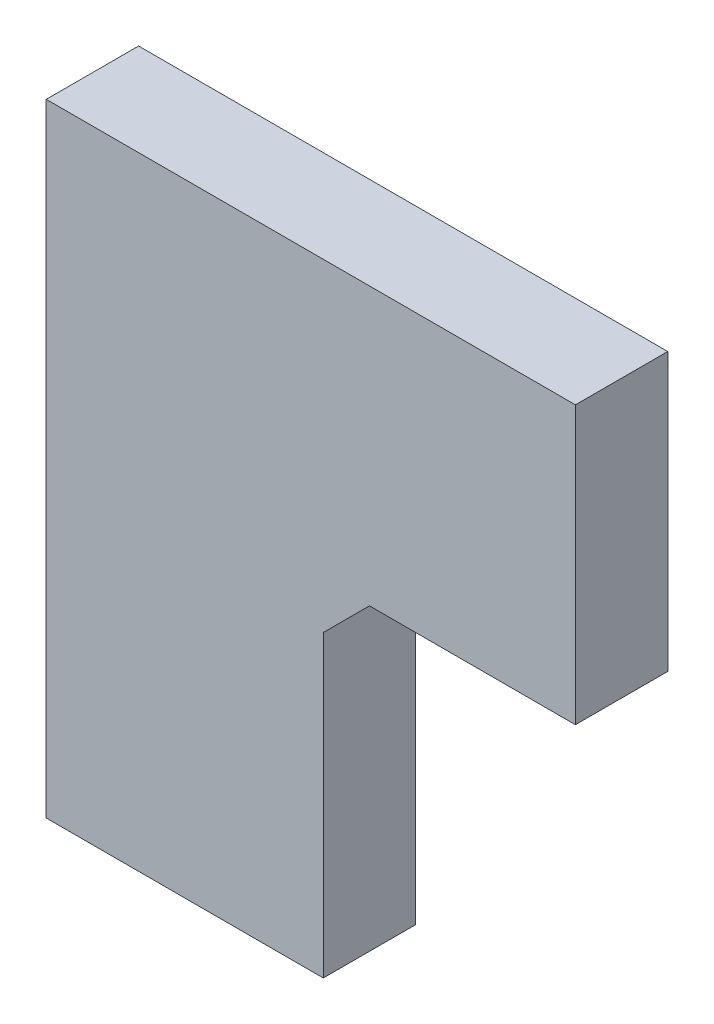
ISO-10303-21;
HEADER;
FILE_DESCRIPTION(('STEP AP214'),'2;1');
FILE_NAME('part.step','',(''),(''),'','','');
FILE_SCHEMA(('AUTOMOTIVE_DESIGN { 1 0 10303 214 1 1 1 1 }'));
ENDSEC;
DATA;
#1=APPLICATION_CONTEXT('core data for automotive mechanical design processes');
#2=APPLICATION_PROTOCOL_DEFINITION('international standard','automotive_design',2000,#1);
#3=PRODUCT_CONTEXT('',#1,'mechanical');
#4=PRODUCT('Part','Part','',(#3));
#5=PRODUCT_RELATED_PRODUCT_CATEGORY('part','',(#4));
#6=PRODUCT_DEFINITION_FORMATION('','',#4);
#7=PRODUCT_DEFINITION_CONTEXT('part definition',#1,'design');
#8=PRODUCT_DEFINITION('design','',#6,#7);
#9=PRODUCT_DEFINITION_SHAPE('','',#8);
#10=(LENGTH_UNIT() NAMED_UNIT(*) SI_UNIT(.MILLI.,.METRE.));
#11=(NAMED_UNIT(*) PLANE_ANGLE_UNIT() SI_UNIT($,.RADIAN.));
#12=(NAMED_UNIT(*) SI_UNIT($,.STERADIAN.) SOLID_ANGLE_UNIT());
#13=UNCERTAINTY_MEASURE_WITH_UNIT(LENGTH_MEASURE(1.E-05),#10,'distance_accuracy_value','');
#14=(GEOMETRIC_REPRESENTATION_CONTEXT(3) GLOBAL_UNCERTAINTY_ASSIGNED_CONTEXT((#13)) GLOBAL_UNIT_ASSIGNED_CONTEXT((#10,
#11,#12)) REPRESENTATION_CONTEXT('',''));
#15=CARTESIAN_POINT('',(0.,0.,0.));
#16=DIRECTION('',(0.,0.,1.));
#17=DIRECTION('',(1.,0.,0.));
#18=AXIS2_PLACEMENT_3D('',#15,#16,#17);
#19=CARTESIAN_POINT('',(0.,0.,0.5));
#20=DIRECTION('',(0.,0.,1.));
#21=DIRECTION('',(1.,0.,0.));
#22=AXIS2_PLACEMENT_3D('',#19,#20,#21);
#23=PLANE('',#22);
#24=DIRECTION('',(0.,-1.,0.));
#25=VECTOR('',#24,1.);
#26=CARTESIAN_POINT('',(6.4000000000007,0.,0.5));
#27=LINE('',#26,#25);
#28=CARTESIAN_POINT('',(6.4000000000007,1.1286796564445,0.5));
#29=VERTEX_POINT('',#28);
#30=CARTESIAN_POINT('',(6.4000000000007,-2.2413203435652,0.5));
#31=VERTEX_POINT('',#30);
#32=EDGE_CURVE('E11',#29,#31,#27,.T.);
#33=ORIENTED_EDGE('',*,*,#32,.T.);
#34=DIRECTION('',(1.,0.,0.));
#35=VECTOR('',#34,1.);
#36=CARTESIAN_POINT('',(0.,-2.2413203435652,0.5));
#37=LINE('',#36,#35);
#38=CARTESIAN_POINT('',(7.9000000000043,-2.2413203435652,0.5));
#39=VERTEX_POINT('',#38);
#40=EDGE_CURVE('E24',#31,#39,#37,.T.);
#41=ORIENTED_EDGE('',*,*,#40,.T.);
#42=DIRECTION('',(0.,1.,0.));
#43=VECTOR('',#42,1.);
#44=CARTESIAN_POINT('',(7.9000000000043,0.,0.5));
#45=LINE('',#44,#43);
#46=CARTESIAN_POINT('',(7.9000000000043,-0.62132034356386,0.5));
#47=VERTEX_POINT('',#46);
#48=EDGE_CURVE('E132',#39,#47,#45,.T.);
#49=ORIENTED_EDGE('',*,*,#48,.T.);
#50=DIRECTION('',(-0.707106781186548,-0.707106781186548,0.));
#51=VECTOR('',#50,1.);
#52=CARTESIAN_POINT('',(4.2606601717841,-4.2606601717841,0.5));
#53=LINE('',#52,#51);
#54=CARTESIAN_POINT('',(8.1500000000045,-0.371320343563615,0.5));
#55=VERTEX_POINT('',#54);
#56=EDGE_CURVE('E130',#55,#47,#53,.T.);
#57=ORIENTED_EDGE('',*,*,#56,.F.);
#58=DIRECTION('',(-1.,0.,0.));
#59=VECTOR('',#58,1.);
#60=CARTESIAN_POINT('',(0.,-0.371320343563604,0.5));
#61=LINE('',#60,#59);
#62=CARTESIAN_POINT('',(9.2650000000007,-0.371320343563617,0.5));
#63=VERTEX_POINT('',#62);
#64=EDGE_CURVE('E96',#63,#55,#61,.T.);
#65=ORIENTED_EDGE('',*,*,#64,.F.);
#66=DIRECTION('',(0.,-1.,0.));
#67=VECTOR('',#66,1.);
#68=CARTESIAN_POINT('',(9.2650000000007,0.,0.5));
#69=LINE('',#68,#67);
#70=CARTESIAN_POINT('',(9.2650000000007,1.1286796564445,0.5));
#71=VERTEX_POINT('',#70);
#72=EDGE_CURVE('E126',#71,#63,#69,.T.);
#73=ORIENTED_EDGE('',*,*,#72,.F.);
#74=DIRECTION('',(-1.,0.,0.));
#75=VECTOR('',#74,1.);
#76=CARTESIAN_POINT('',(0.,1.1286796564445,0.5));
#77=LINE('',#76,#75);
#78=EDGE_CURVE('E124',#71,#29,#77,.T.);
#79=ORIENTED_EDGE('',*,*,#78,.T.);
#80=EDGE_LOOP('',(#33,#41,#49,#57,#65,#73,#79));
#81=FACE_BOUND('',#80,.T.);
#82=ADVANCED_FACE('F17',(#81),#23,.T.);
#83=CARTESIAN_POINT('',(7.9000000000043,0.,0.5));
#84=DIRECTION('',(-1.,0.,0.));
#85=DIRECTION('',(0.,-1.,0.));
#86=AXIS2_PLACEMENT_3D('',#83,#84,#85);
#87=PLANE('',#86);
#88=DIRECTION('',(0.,0.,1.));
#89=VECTOR('',#88,1.);
#90=CARTESIAN_POINT('',(7.9000000000043,-2.2413203435652,0.5));
#91=LINE('',#90,#89);
#92=CARTESIAN_POINT('',(7.9000000000043,-2.2413203435652,0.));
#93=VERTEX_POINT('',#92);
#94=EDGE_CURVE('E121',#93,#39,#91,.T.);
#95=ORIENTED_EDGE('',*,*,#94,.F.);
#96=DIRECTION('',(0.,1.,0.));
#97=VECTOR('',#96,1.);
#98=CARTESIAN_POINT('',(7.9000000000043,0.,0.));
#99=LINE('',#98,#97);
#100=CARTESIAN_POINT('',(7.9000000000043,-0.62132034356386,0.));
#101=VERTEX_POINT('',#100);
#102=EDGE_CURVE('E119',#93,#101,#99,.T.);
#103=ORIENTED_EDGE('',*,*,#102,.T.);
#104=DIRECTION('',(0.,0.,-1.));
#105=VECTOR('',#104,1.);
#106=CARTESIAN_POINT('',(7.9000000000043,-0.62132034356386,0.5));
#107=LINE('',#106,#105);
#108=EDGE_CURVE('E91',#47,#101,#107,.T.);
#109=ORIENTED_EDGE('',*,*,#108,.F.);
#110=ORIENTED_EDGE('',*,*,#48,.F.);
#111=EDGE_LOOP('',(#95,#103,#109,#110));
#112=FACE_BOUND('',#111,.T.);
#113=ADVANCED_FACE('F136',(#112),#87,.F.);
#114=CARTESIAN_POINT('',(0.,0.,0.));
#115=DIRECTION('',(0.,0.,1.));
#116=DIRECTION('',(1.,0.,0.));
#117=AXIS2_PLACEMENT_3D('',#114,#115,#116);
#118=PLANE('',#117);
#119=DIRECTION('',(1.,0.,0.));
#120=VECTOR('',#119,1.);
#121=CARTESIAN_POINT('',(0.,-2.2413203435652,0.));
#122=LINE('',#121,#120);
#123=CARTESIAN_POINT('',(6.4000000000007,-2.2413203435652,0.));
#124=VERTEX_POINT('',#123);
#125=EDGE_CURVE('E115',#124,#93,#122,.T.);
#126=ORIENTED_EDGE('',*,*,#125,.F.);
#127=DIRECTION('',(0.,-1.,0.));
#128=VECTOR('',#127,1.);
#129=CARTESIAN_POINT('',(6.4000000000007,0.,0.));
#130=LINE('',#129,#128);
#131=CARTESIAN_POINT('',(6.4000000000007,1.1286796564445,0.));
#132=VERTEX_POINT('',#131);
#133=EDGE_CURVE('E112',#132,#124,#130,.T.);
#134=ORIENTED_EDGE('',*,*,#133,.F.);
#135=DIRECTION('',(-1.,0.,0.));
#136=VECTOR('',#135,1.);
#137=CARTESIAN_POINT('',(0.,1.1286796564445,0.));
#138=LINE('',#137,#136);
#139=CARTESIAN_POINT('',(9.2650000000007,1.1286796564445,0.));
#140=VERTEX_POINT('',#139);
#141=EDGE_CURVE('E109',#140,#132,#138,.T.);
#142=ORIENTED_EDGE('',*,*,#141,.F.);
#143=DIRECTION('',(0.,-1.,0.));
#144=VECTOR('',#143,1.);
#145=CARTESIAN_POINT('',(9.2650000000007,0.,0.));
#146=LINE('',#145,#144);
#147=CARTESIAN_POINT('',(9.2650000000007,-0.371320343563617,0.));
#148=VERTEX_POINT('',#147);
#149=EDGE_CURVE('E78',#140,#148,#146,.T.);
#150=ORIENTED_EDGE('',*,*,#149,.T.);
#151=DIRECTION('',(-1.,0.,0.));
#152=VECTOR('',#151,1.);
#153=CARTESIAN_POINT('',(0.,-0.371320343563604,0.));
#154=LINE('',#153,#152);
#155=CARTESIAN_POINT('',(8.1500000000045,-0.371320343563615,0.));
#156=VERTEX_POINT('',#155);
#157=EDGE_CURVE('E72',#148,#156,#154,.T.);
#158=ORIENTED_EDGE('',*,*,#157,.T.);
#159=DIRECTION('',(-0.707106781186548,-0.707106781186548,0.));
#160=VECTOR('',#159,1.);
#161=CARTESIAN_POINT('',(4.2606601717841,-4.2606601717841,0.));
#162=LINE('',#161,#160);
#163=EDGE_CURVE('E76',#156,#101,#162,.T.);
#164=ORIENTED_EDGE('',*,*,#163,.T.);
#165=ORIENTED_EDGE('',*,*,#102,.F.);
#166=EDGE_LOOP('',(#126,#134,#142,#150,#158,#164,#165));
#167=FACE_BOUND('',#166,.T.);
#168=ADVANCED_FACE('F74',(#167),#118,.F.);
#169=CARTESIAN_POINT('',(6.4000000000007,0.,0.5));
#170=DIRECTION('',(1.,0.,0.));
#171=DIRECTION('',(0.,1.,0.));
#172=AXIS2_PLACEMENT_3D('',#169,#170,#171);
#173=PLANE('',#172);
#174=DIRECTION('',(0.,0.,-1.));
#175=VECTOR('',#174,1.);
#176=CARTESIAN_POINT('',(6.4000000000007,-2.2413203435652,0.5));
#177=LINE('',#176,#175);
#178=EDGE_CURVE('E92',#31,#124,#177,.T.);
#179=ORIENTED_EDGE('',*,*,#178,.F.);
#180=ORIENTED_EDGE('',*,*,#32,.F.);
#181=DIRECTION('',(0.,0.,-1.));
#182=VECTOR('',#181,1.);
#183=CARTESIAN_POINT('',(6.4000000000007,1.1286796564445,0.5));
#184=LINE('',#183,#182);
#185=EDGE_CURVE('E104',#29,#132,#184,.T.);
#186=ORIENTED_EDGE('',*,*,#185,.T.);
#187=ORIENTED_EDGE('',*,*,#133,.T.);
#188=EDGE_LOOP('',(#179,#180,#186,#187));
#189=FACE_BOUND('',#188,.T.);
#190=ADVANCED_FACE('F138',(#189),#173,.F.);
#191=CARTESIAN_POINT('',(0.,1.1286796564445,0.5));
#192=DIRECTION('',(0.,-1.,0.));
#193=DIRECTION('',(0.,0.,-1.));
#194=AXIS2_PLACEMENT_3D('',#191,#192,#193);
#195=PLANE('',#194);
#196=ORIENTED_EDGE('',*,*,#141,.T.);
#197=ORIENTED_EDGE('',*,*,#185,.F.);
#198=ORIENTED_EDGE('',*,*,#78,.F.);
#199=DIRECTION('',(0.,0.,-1.));
#200=VECTOR('',#199,1.);
#201=CARTESIAN_POINT('',(9.2650000000007,1.1286796564445,0.5));
#202=LINE('',#201,#200);
#203=EDGE_CURVE('E99',#71,#140,#202,.T.);
#204=ORIENTED_EDGE('',*,*,#203,.T.);
#205=EDGE_LOOP('',(#196,#197,#198,#204));
#206=FACE_BOUND('',#205,.T.);
#207=ADVANCED_FACE('F142',(#206),#195,.F.);
#208=CARTESIAN_POINT('',(9.2650000000007,0.,0.5));
#209=DIRECTION('',(1.,0.,0.));
#210=DIRECTION('',(0.,0.,-1.));
#211=AXIS2_PLACEMENT_3D('',#208,#209,#210);
#212=PLANE('',#211);
#213=ORIENTED_EDGE('',*,*,#149,.F.);
#214=ORIENTED_EDGE('',*,*,#203,.F.);
#215=ORIENTED_EDGE('',*,*,#72,.T.);
#216=DIRECTION('',(0.,0.,-1.));
#217=VECTOR('',#216,1.);
#218=CARTESIAN_POINT('',(9.2650000000007,-0.371320343563617,0.5));
#219=LINE('',#218,#217);
#220=EDGE_CURVE('E97',#63,#148,#219,.T.);
#221=ORIENTED_EDGE('',*,*,#220,.T.);
#222=EDGE_LOOP('',(#213,#214,#215,#221));
#223=FACE_BOUND('',#222,.T.);
#224=ADVANCED_FACE('F145',(#223),#212,.T.);
#225=CARTESIAN_POINT('',(0.,-0.371320343563604,0.5));
#226=DIRECTION('',(0.,-1.,0.));
#227=DIRECTION('',(1.,0.,0.));
#228=AXIS2_PLACEMENT_3D('',#225,#226,#227);
#229=PLANE('',#228);
#230=ORIENTED_EDGE('',*,*,#157,.F.);
#231=ORIENTED_EDGE('',*,*,#220,.F.);
#232=ORIENTED_EDGE('',*,*,#64,.T.);
#233=DIRECTION('',(0.,0.,-1.));
#234=VECTOR('',#233,1.);
#235=CARTESIAN_POINT('',(8.1500000000045,-0.371320343563615,0.5));
#236=LINE('',#235,#234);
#237=EDGE_CURVE('E89',#55,#156,#236,.T.);
#238=ORIENTED_EDGE('',*,*,#237,.T.);
#239=EDGE_LOOP('',(#230,#231,#232,#238));
#240=FACE_BOUND('',#239,.T.);
#241=ADVANCED_FACE('F95',(#240),#229,.T.);
#242=CARTESIAN_POINT('',(4.2606601717841,-4.2606601717841,0.5));
#243=DIRECTION('',(0.707106781186548,-0.707106781186548,0.));
#244=DIRECTION('',(0.707106781186548,0.707106781186548,0.));
#245=AXIS2_PLACEMENT_3D('',#242,#243,#244);
#246=PLANE('',#245);
#247=ORIENTED_EDGE('',*,*,#163,.F.);
#248=ORIENTED_EDGE('',*,*,#237,.F.);
#249=ORIENTED_EDGE('',*,*,#56,.T.);
#250=ORIENTED_EDGE('',*,*,#108,.T.);
#251=EDGE_LOOP('',(#247,#248,#249,#250));
#252=FACE_BOUND('',#251,.T.);
#253=ADVANCED_FACE('F87',(#252),#246,.T.);
#254=CARTESIAN_POINT('',(3.88578058618805E-13,-2.2413203435652,-0.01));
#255=DIRECTION('',(0.,-1.,0.));
#256=DIRECTION('',(1.,0.,0.));
#257=AXIS2_PLACEMENT_3D('',#254,#255,#256);
#258=PLANE('',#257);
#259=ORIENTED_EDGE('',*,*,#40,.F.);
#260=ORIENTED_EDGE('',*,*,#178,.T.);
#261=ORIENTED_EDGE('',*,*,#125,.T.);
#262=ORIENTED_EDGE('',*,*,#94,.T.);
#263=EDGE_LOOP('',(#259,#260,#261,#262));
#264=FACE_BOUND('',#263,.T.);
#265=ADVANCED_FACE('F137',(#264),#258,.T.);
#266=CLOSED_SHELL('',(#82,#113,#168,#190,#207,#224,#241,#253,#265));
#267=MANIFOLD_SOLID_BREP('B1',#266);
#268=ADVANCED_BREP_SHAPE_REPRESENTATION('',(#18,#267),#14);
#269=SHAPE_DEFINITION_REPRESENTATION(#9,#268);
ENDSEC;
END-ISO-10303-21;
